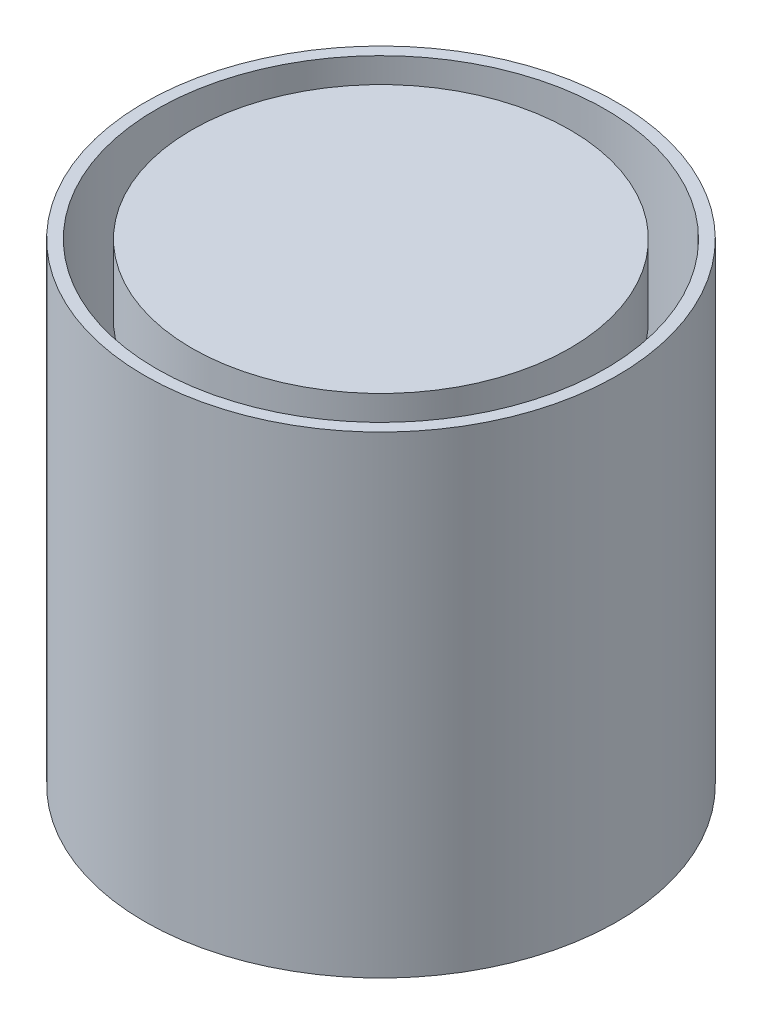
ISO-10303-21;
HEADER;
FILE_DESCRIPTION(('STEP AP214'),'2;1');
FILE_NAME('part.step','',(''),(''),'','','');
FILE_SCHEMA(('AUTOMOTIVE_DESIGN { 1 0 10303 214 1 1 1 1 }'));
ENDSEC;
DATA;
#1=APPLICATION_CONTEXT('core data for automotive mechanical design processes');
#2=APPLICATION_PROTOCOL_DEFINITION('international standard','automotive_design',2000,#1);
#3=PRODUCT_CONTEXT('',#1,'mechanical');
#4=PRODUCT('Part','Part','',(#3));
#5=PRODUCT_RELATED_PRODUCT_CATEGORY('part','',(#4));
#6=PRODUCT_DEFINITION_FORMATION('','',#4);
#7=PRODUCT_DEFINITION_CONTEXT('part definition',#1,'design');
#8=PRODUCT_DEFINITION('design','',#6,#7);
#9=PRODUCT_DEFINITION_SHAPE('','',#8);
#10=(LENGTH_UNIT() NAMED_UNIT(*) SI_UNIT(.MILLI.,.METRE.));
#11=(NAMED_UNIT(*) PLANE_ANGLE_UNIT() SI_UNIT($,.RADIAN.));
#12=(NAMED_UNIT(*) SI_UNIT($,.STERADIAN.) SOLID_ANGLE_UNIT());
#13=UNCERTAINTY_MEASURE_WITH_UNIT(LENGTH_MEASURE(1.E-05),#10,'distance_accuracy_value','');
#14=(GEOMETRIC_REPRESENTATION_CONTEXT(3) GLOBAL_UNCERTAINTY_ASSIGNED_CONTEXT((#13)) GLOBAL_UNIT_ASSIGNED_CONTEXT((#10,
#11,#12)) REPRESENTATION_CONTEXT('',''));
#15=CARTESIAN_POINT('',(0.,0.,0.));
#16=DIRECTION('',(0.,0.,1.));
#17=DIRECTION('',(1.,0.,0.));
#18=AXIS2_PLACEMENT_3D('',#15,#16,#17);
#19=CARTESIAN_POINT('',(0.,-30.,0.));
#20=DIRECTION('',(0.,1.,0.));
#21=DIRECTION('',(0.,0.,1.));
#22=AXIS2_PLACEMENT_3D('',#19,#20,#21);
#23=CYLINDRICAL_SURFACE('',#22,80.);
#24=CARTESIAN_POINT('',(0.,-30.,0.));
#25=DIRECTION('',(0.,1.,0.));
#26=DIRECTION('',(0.,0.,1.));
#27=AXIS2_PLACEMENT_3D('',#24,#25,#26);
#28=CIRCLE('',#27,80.);
#29=CARTESIAN_POINT('',(0.,-30.,80.));
#30=VERTEX_POINT('',#29);
#31=EDGE_CURVE('E11',#30,#30,#28,.T.);
#32=ORIENTED_EDGE('',*,*,#31,.T.);
#33=EDGE_LOOP('',(#32));
#34=FACE_BOUND('',#33,.T.);
#35=CARTESIAN_POINT('',(0.,0.,0.));
#36=DIRECTION('',(0.,1.,0.));
#37=DIRECTION('',(0.,0.,1.));
#38=AXIS2_PLACEMENT_3D('',#35,#36,#37);
#39=CIRCLE('',#38,80.);
#40=CARTESIAN_POINT('',(0.,0.,80.));
#41=VERTEX_POINT('',#40);
#42=EDGE_CURVE('E50',#41,#41,#39,.T.);
#43=ORIENTED_EDGE('',*,*,#42,.F.);
#44=EDGE_LOOP('',(#43));
#45=FACE_BOUND('',#44,.T.);
#46=ADVANCED_FACE('F47',(#34,#45),#23,.T.);
#47=CARTESIAN_POINT('',(0.,-30.,0.));
#48=DIRECTION('',(0.,1.,0.));
#49=DIRECTION('',(0.,0.,1.));
#50=AXIS2_PLACEMENT_3D('',#47,#48,#49);
#51=PLANE('',#50);
#52=ORIENTED_EDGE('',*,*,#31,.F.);
#53=EDGE_LOOP('',(#52));
#54=FACE_BOUND('',#53,.T.);
#55=ADVANCED_FACE('F62',(#54),#51,.F.);
#56=CARTESIAN_POINT('',(0.,0.,0.));
#57=DIRECTION('',(0.,1.,0.));
#58=DIRECTION('',(0.,0.,1.));
#59=AXIS2_PLACEMENT_3D('',#56,#57,#58);
#60=PLANE('',#59);
#61=ORIENTED_EDGE('',*,*,#42,.T.);
#62=EDGE_LOOP('',(#61));
#63=FACE_BOUND('',#62,.T.);
#64=ADVANCED_FACE('F59',(#63),#60,.T.);
#65=CLOSED_SHELL('',(#46,#55,#64));
#66=MANIFOLD_SOLID_BREP('B2',#65);
#67=CARTESIAN_POINT('',(0.,-200.,0.));
#68=DIRECTION('',(0.,1.,0.));
#69=DIRECTION('',(0.,0.,1.));
#70=AXIS2_PLACEMENT_3D('',#67,#68,#69);
#71=CYLINDRICAL_SURFACE('',#70,100.);
#72=CARTESIAN_POINT('',(0.,-200.,0.));
#73=DIRECTION('',(0.,1.,0.));
#74=DIRECTION('',(0.,0.,1.));
#75=AXIS2_PLACEMENT_3D('',#72,#73,#74);
#76=CIRCLE('',#75,100.);
#77=CARTESIAN_POINT('',(0.,-200.,100.));
#78=VERTEX_POINT('',#77);
#79=EDGE_CURVE('E46',#78,#78,#76,.T.);
#80=ORIENTED_EDGE('',*,*,#79,.T.);
#81=EDGE_LOOP('',(#80));
#82=FACE_BOUND('',#81,.T.);
#83=CARTESIAN_POINT('',(0.,0.,0.));
#84=DIRECTION('',(0.,1.,0.));
#85=DIRECTION('',(0.,0.,1.));
#86=AXIS2_PLACEMENT_3D('',#83,#84,#85);
#87=CIRCLE('',#86,100.);
#88=CARTESIAN_POINT('',(0.,0.,100.));
#89=VERTEX_POINT('',#88);
#90=EDGE_CURVE('E97',#89,#89,#87,.T.);
#91=ORIENTED_EDGE('',*,*,#90,.F.);
#92=EDGE_LOOP('',(#91));
#93=FACE_BOUND('',#92,.T.);
#94=ADVANCED_FACE('F94',(#82,#93),#71,.T.);
#95=CARTESIAN_POINT('',(0.,-200.,0.));
#96=DIRECTION('',(0.,1.,0.));
#97=DIRECTION('',(0.,0.,1.));
#98=AXIS2_PLACEMENT_3D('',#95,#96,#97);
#99=PLANE('',#98);
#100=CARTESIAN_POINT('',(0.,-200.,0.));
#101=DIRECTION('',(0.,1.,0.));
#102=DIRECTION('',(0.,0.,1.));
#103=AXIS2_PLACEMENT_3D('',#100,#101,#102);
#104=CIRCLE('',#103,95.);
#105=CARTESIAN_POINT('',(0.,-200.,95.));
#106=VERTEX_POINT('',#105);
#107=EDGE_CURVE('E104',#106,#106,#104,.T.);
#108=ORIENTED_EDGE('',*,*,#107,.T.);
#109=EDGE_LOOP('',(#108));
#110=FACE_BOUND('',#109,.T.);
#111=ORIENTED_EDGE('',*,*,#79,.F.);
#112=EDGE_LOOP('',(#111));
#113=FACE_BOUND('',#112,.T.);
#114=ADVANCED_FACE('F112',(#110,#113),#99,.F.);
#115=CARTESIAN_POINT('',(0.,0.,0.));
#116=DIRECTION('',(0.,1.,0.));
#117=DIRECTION('',(0.,0.,1.));
#118=AXIS2_PLACEMENT_3D('',#115,#116,#117);
#119=PLANE('',#118);
#120=CARTESIAN_POINT('',(0.,0.,0.));
#121=DIRECTION('',(0.,1.,0.));
#122=DIRECTION('',(0.,0.,1.));
#123=AXIS2_PLACEMENT_3D('',#120,#121,#122);
#124=CIRCLE('',#123,95.);
#125=CARTESIAN_POINT('',(0.,0.,95.));
#126=VERTEX_POINT('',#125);
#127=EDGE_CURVE('E106',#126,#126,#124,.T.);
#128=ORIENTED_EDGE('',*,*,#127,.F.);
#129=EDGE_LOOP('',(#128));
#130=FACE_BOUND('',#129,.T.);
#131=ORIENTED_EDGE('',*,*,#90,.T.);
#132=EDGE_LOOP('',(#131));
#133=FACE_BOUND('',#132,.T.);
#134=ADVANCED_FACE('F118',(#130,#133),#119,.T.);
#135=CARTESIAN_POINT('',(0.,-200.,0.));
#136=DIRECTION('',(0.,1.,0.));
#137=DIRECTION('',(0.,0.,1.));
#138=AXIS2_PLACEMENT_3D('',#135,#136,#137);
#139=CYLINDRICAL_SURFACE('',#138,95.);
#140=ORIENTED_EDGE('',*,*,#107,.F.);
#141=EDGE_LOOP('',(#140));
#142=FACE_BOUND('',#141,.T.);
#143=ORIENTED_EDGE('',*,*,#127,.T.);
#144=EDGE_LOOP('',(#143));
#145=FACE_BOUND('',#144,.T.);
#146=ADVANCED_FACE('F115',(#142,#145),#139,.F.);
#147=CLOSED_SHELL('',(#94,#114,#134,#146));
#148=MANIFOLD_SOLID_BREP('B6',#147);
#149=ADVANCED_BREP_SHAPE_REPRESENTATION('',(#18,#66,#148),#14);
#150=SHAPE_DEFINITION_REPRESENTATION(#9,#149);
ENDSEC;
END-ISO-10303-21;
